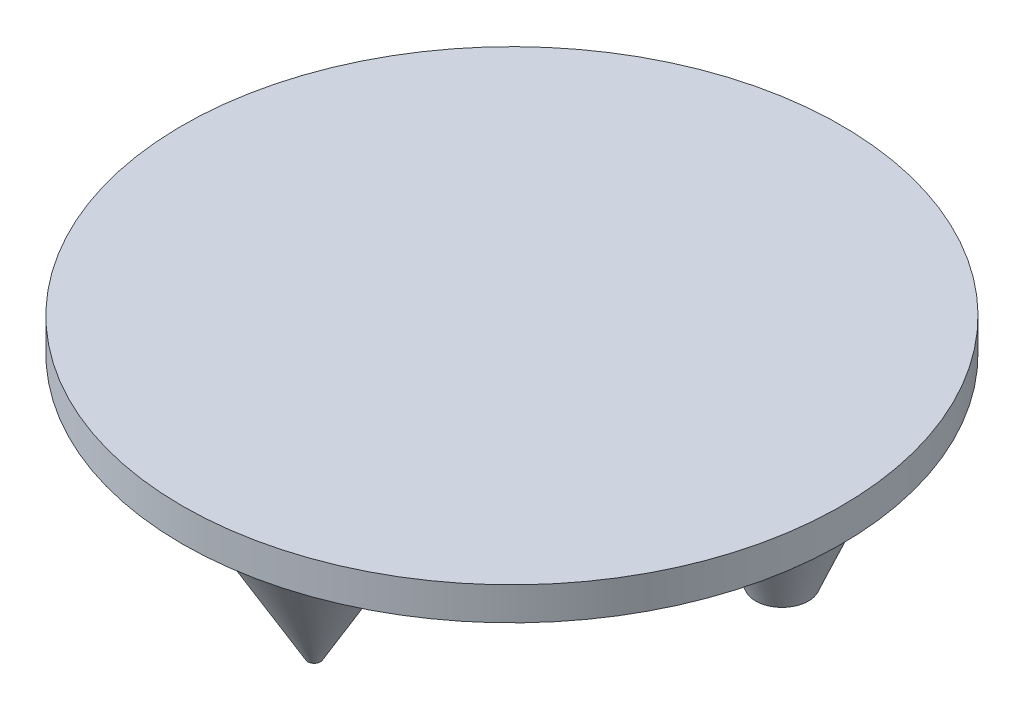
ISO-10303-21;
HEADER;
FILE_DESCRIPTION(('STEP AP214'),'2;1');
FILE_NAME('part.step','',(''),(''),'','','');
FILE_SCHEMA(('AUTOMOTIVE_DESIGN { 1 0 10303 214 1 1 1 1 }'));
ENDSEC;
DATA;
#1=APPLICATION_CONTEXT('core data for automotive mechanical design processes');
#2=APPLICATION_PROTOCOL_DEFINITION('international standard','automotive_design',2000,#1);
#3=PRODUCT_CONTEXT('',#1,'mechanical');
#4=PRODUCT('Part','Part','',(#3));
#5=PRODUCT_RELATED_PRODUCT_CATEGORY('part','',(#4));
#6=PRODUCT_DEFINITION_FORMATION('','',#4);
#7=PRODUCT_DEFINITION_CONTEXT('part definition',#1,'design');
#8=PRODUCT_DEFINITION('design','',#6,#7);
#9=PRODUCT_DEFINITION_SHAPE('','',#8);
#10=(LENGTH_UNIT() NAMED_UNIT(*) SI_UNIT(.MILLI.,.METRE.));
#11=(NAMED_UNIT(*) PLANE_ANGLE_UNIT() SI_UNIT($,.RADIAN.));
#12=(NAMED_UNIT(*) SI_UNIT($,.STERADIAN.) SOLID_ANGLE_UNIT());
#13=UNCERTAINTY_MEASURE_WITH_UNIT(LENGTH_MEASURE(1.E-05),#10,'distance_accuracy_value','');
#14=(GEOMETRIC_REPRESENTATION_CONTEXT(3) GLOBAL_UNCERTAINTY_ASSIGNED_CONTEXT((#13)) GLOBAL_UNIT_ASSIGNED_CONTEXT((#10,
#11,#12)) REPRESENTATION_CONTEXT('',''));
#15=CARTESIAN_POINT('',(0.,0.,0.));
#16=DIRECTION('',(0.,0.,1.));
#17=DIRECTION('',(1.,0.,0.));
#18=AXIS2_PLACEMENT_3D('',#15,#16,#17);
#19=CARTESIAN_POINT('',(0.,1.27,0.));
#20=DIRECTION('',(0.,-1.,0.));
#21=DIRECTION('',(0.,0.,-1.));
#22=AXIS2_PLACEMENT_3D('',#19,#20,#21);
#23=CYLINDRICAL_SURFACE('',#22,12.7);
#24=CARTESIAN_POINT('',(0.,1.27,0.));
#25=DIRECTION('',(0.,1.,0.));
#26=DIRECTION('',(0.,0.,1.));
#27=AXIS2_PLACEMENT_3D('',#24,#25,#26);
#28=CIRCLE('',#27,12.7);
#29=CARTESIAN_POINT('',(0.,1.27,12.7));
#30=VERTEX_POINT('',#29);
#31=EDGE_CURVE('E85',#30,#30,#28,.T.);
#32=ORIENTED_EDGE('',*,*,#31,.F.);
#33=EDGE_LOOP('',(#32));
#34=FACE_BOUND('',#33,.T.);
#35=CARTESIAN_POINT('',(0.,0.,0.));
#36=DIRECTION('',(0.,1.,0.));
#37=DIRECTION('',(0.,0.,1.));
#38=AXIS2_PLACEMENT_3D('',#35,#36,#37);
#39=CIRCLE('',#38,12.7);
#40=CARTESIAN_POINT('',(0.,0.,12.7));
#41=VERTEX_POINT('',#40);
#42=EDGE_CURVE('E78',#41,#41,#39,.T.);
#43=ORIENTED_EDGE('',*,*,#42,.T.);
#44=EDGE_LOOP('',(#43));
#45=FACE_BOUND('',#44,.T.);
#46=ADVANCED_FACE('F36',(#34,#45),#23,.T.);
#47=CARTESIAN_POINT('',(0.,1.27,0.));
#48=DIRECTION('',(0.,1.,0.));
#49=DIRECTION('',(0.,0.,1.));
#50=AXIS2_PLACEMENT_3D('',#47,#48,#49);
#51=PLANE('',#50);
#52=ORIENTED_EDGE('',*,*,#31,.T.);
#53=EDGE_LOOP('',(#52));
#54=FACE_BOUND('',#53,.T.);
#55=ADVANCED_FACE('F94',(#54),#51,.T.);
#56=CARTESIAN_POINT('',(0.,0.,0.));
#57=DIRECTION('',(0.,1.,0.));
#58=DIRECTION('',(0.,0.,1.));
#59=AXIS2_PLACEMENT_3D('',#56,#57,#58);
#60=PLANE('',#59);
#61=CARTESIAN_POINT('',(-6.59911357683741,0.,-3.81000000000003));
#62=DIRECTION('',(0.,1.,0.));
#63=DIRECTION('',(0.,0.,1.));
#64=AXIS2_PLACEMENT_3D('',#61,#62,#63);
#65=CIRCLE('',#64,3.175);
#66=CARTESIAN_POINT('',(-6.59911357683741,0.,-0.63500000000003));
#67=VERTEX_POINT('',#66);
#68=EDGE_CURVE('E73',#67,#67,#65,.F.);
#69=ORIENTED_EDGE('',*,*,#68,.F.);
#70=EDGE_LOOP('',(#69));
#71=FACE_BOUND('',#70,.T.);
#72=CARTESIAN_POINT('',(6.59911357683746,0.,-3.80999999999994));
#73=DIRECTION('',(0.,1.,0.));
#74=DIRECTION('',(0.,0.,1.));
#75=AXIS2_PLACEMENT_3D('',#72,#73,#74);
#76=CIRCLE('',#75,3.175);
#77=CARTESIAN_POINT('',(6.59911357683746,0.,-0.634999999999937));
#78=VERTEX_POINT('',#77);
#79=EDGE_CURVE('E77',#78,#78,#76,.F.);
#80=ORIENTED_EDGE('',*,*,#79,.F.);
#81=EDGE_LOOP('',(#80));
#82=FACE_BOUND('',#81,.T.);
#83=CARTESIAN_POINT('',(0.,0.,7.62));
#84=DIRECTION('',(0.,-1.,0.));
#85=DIRECTION('',(0.,0.,-1.));
#86=AXIS2_PLACEMENT_3D('',#83,#84,#85);
#87=CIRCLE('',#86,3.175);
#88=CARTESIAN_POINT('',(0.,0.,4.445));
#89=VERTEX_POINT('',#88);
#90=EDGE_CURVE('E79',#89,#89,#87,.T.);
#91=ORIENTED_EDGE('',*,*,#90,.F.);
#92=EDGE_LOOP('',(#91));
#93=FACE_BOUND('',#92,.T.);
#94=ORIENTED_EDGE('',*,*,#42,.F.);
#95=EDGE_LOOP('',(#94));
#96=FACE_BOUND('',#95,.T.);
#97=ADVANCED_FACE('F92',(#71,#82,#93,#96),#60,.F.);
#98=CARTESIAN_POINT('',(0.,-6.35,7.62));
#99=DIRECTION('',(0.,1.,0.));
#100=DIRECTION('',(0.,0.,1.));
#101=AXIS2_PLACEMENT_3D('',#98,#99,#100);
#102=CYLINDRICAL_SURFACE('',#101,3.175);
#103=CARTESIAN_POINT('',(0.,-0.589409051224924,7.62));
#104=DIRECTION('',(0.,-1.,0.));
#105=DIRECTION('',(0.,0.,-1.));
#106=AXIS2_PLACEMENT_3D('',#103,#104,#105);
#107=CIRCLE('',#106,3.175);
#108=CARTESIAN_POINT('',(0.,-0.589409051224924,4.445));
#109=VERTEX_POINT('',#108);
#110=EDGE_CURVE('E52',#109,#109,#107,.F.);
#111=ORIENTED_EDGE('',*,*,#110,.T.);
#112=EDGE_LOOP('',(#111));
#113=FACE_BOUND('',#112,.T.);
#114=ORIENTED_EDGE('',*,*,#90,.T.);
#115=EDGE_LOOP('',(#114));
#116=FACE_BOUND('',#115,.T.);
#117=ADVANCED_FACE('F87',(#113,#116),#102,.T.);
#118=CARTESIAN_POINT('',(0.,-6.35,7.62));
#119=DIRECTION('',(0.,-1.,0.));
#120=DIRECTION('',(0.,0.,-1.));
#121=AXIS2_PLACEMENT_3D('',#118,#119,#120);
#122=PLANE('',#121);
#123=CARTESIAN_POINT('',(0.,-6.35,7.62));
#124=DIRECTION('',(0.,-1.,0.));
#125=DIRECTION('',(0.,0.,-1.));
#126=AXIS2_PLACEMENT_3D('',#123,#124,#125);
#127=CIRCLE('',#126,0.242060632516702);
#128=CARTESIAN_POINT('',(0.,-6.35,7.8620606325167));
#129=VERTEX_POINT('',#128);
#130=EDGE_CURVE('E66',#129,#129,#127,.T.);
#131=ORIENTED_EDGE('',*,*,#130,.T.);
#132=EDGE_LOOP('',(#131));
#133=FACE_BOUND('',#132,.T.);
#134=ADVANCED_FACE('F143',(#133),#122,.T.);
#135=CARTESIAN_POINT('',(6.59911357683746,-6.35,-3.80999999999994));
#136=DIRECTION('',(0.,1.,0.));
#137=DIRECTION('',(0.866025403784443,0.,-0.499999999999992));
#138=AXIS2_PLACEMENT_3D('',#135,#136,#137);
#139=CYLINDRICAL_SURFACE('',#138,3.175);
#140=CARTESIAN_POINT('',(6.59911357683746,-0.753231159463757,-3.80999999999994));
#141=DIRECTION('',(0.,-1.,0.));
#142=DIRECTION('',(0.,0.,-1.));
#143=AXIS2_PLACEMENT_3D('',#140,#141,#142);
#144=CIRCLE('',#143,3.175);
#145=CARTESIAN_POINT('',(6.59911357683746,-0.753231159463757,-6.98499999999994));
#146=VERTEX_POINT('',#145);
#147=EDGE_CURVE('E64',#146,#146,#144,.F.);
#148=ORIENTED_EDGE('',*,*,#147,.T.);
#149=EDGE_LOOP('',(#148));
#150=FACE_BOUND('',#149,.T.);
#151=ORIENTED_EDGE('',*,*,#79,.T.);
#152=EDGE_LOOP('',(#151));
#153=FACE_BOUND('',#152,.T.);
#154=ADVANCED_FACE('F155',(#150,#153),#139,.T.);
#155=CARTESIAN_POINT('',(6.59911357683746,-6.35,-3.80999999999994));
#156=DIRECTION('',(0.,-1.,0.));
#157=DIRECTION('',(-0.866025403784443,0.,0.499999999999992));
#158=AXIS2_PLACEMENT_3D('',#155,#156,#157);
#159=PLANE('',#158);
#160=CARTESIAN_POINT('',(6.59911357683746,-6.35,-3.80999999999994));
#161=DIRECTION('',(0.,-1.,0.));
#162=DIRECTION('',(0.,0.,-1.));
#163=AXIS2_PLACEMENT_3D('',#160,#161,#162);
#164=CIRCLE('',#163,1.0186679336552);
#165=CARTESIAN_POINT('',(6.59911357683746,-6.35,-4.82866793365514));
#166=VERTEX_POINT('',#165);
#167=EDGE_CURVE('E70',#166,#166,#164,.T.);
#168=ORIENTED_EDGE('',*,*,#167,.T.);
#169=EDGE_LOOP('',(#168));
#170=FACE_BOUND('',#169,.T.);
#171=ADVANCED_FACE('F160',(#170),#159,.T.);
#172=CARTESIAN_POINT('',(-6.59911357683741,-6.35,-3.81000000000003));
#173=DIRECTION('',(0.,1.,0.));
#174=DIRECTION('',(-0.866025403784436,0.,-0.500000000000004));
#175=AXIS2_PLACEMENT_3D('',#172,#173,#174);
#176=CYLINDRICAL_SURFACE('',#175,3.175);
#177=CARTESIAN_POINT('',(-6.59911357683741,-0.913026279855822,-3.81000000000003));
#178=DIRECTION('',(0.,-1.,0.));
#179=DIRECTION('',(0.,0.,-1.));
#180=AXIS2_PLACEMENT_3D('',#177,#178,#179);
#181=CIRCLE('',#180,3.175);
#182=CARTESIAN_POINT('',(-6.59911357683741,-0.913026279855822,-6.98500000000003));
#183=VERTEX_POINT('',#182);
#184=EDGE_CURVE('E44',#183,#183,#181,.F.);
#185=ORIENTED_EDGE('',*,*,#184,.T.);
#186=EDGE_LOOP('',(#185));
#187=FACE_BOUND('',#186,.T.);
#188=ORIENTED_EDGE('',*,*,#68,.T.);
#189=EDGE_LOOP('',(#188));
#190=FACE_BOUND('',#189,.T.);
#191=ADVANCED_FACE('F163',(#187,#190),#176,.T.);
#192=CARTESIAN_POINT('',(-6.59911357683741,-6.35,-3.81000000000003));
#193=DIRECTION('',(0.,-1.,0.));
#194=DIRECTION('',(0.866025403784436,0.,0.500000000000004));
#195=AXIS2_PLACEMENT_3D('',#192,#193,#194);
#196=PLANE('',#195);
#197=CARTESIAN_POINT('',(-6.59911357683741,-6.35,-3.81000000000003));
#198=DIRECTION('',(0.,-1.,0.));
#199=DIRECTION('',(0.,0.,-1.));
#200=AXIS2_PLACEMENT_3D('',#197,#198,#199);
#201=CIRCLE('',#200,1.71833344034524);
#202=CARTESIAN_POINT('',(-6.59911357683741,-6.35,-5.52833344034527));
#203=VERTEX_POINT('',#202);
#204=EDGE_CURVE('E63',#203,#203,#201,.T.);
#205=ORIENTED_EDGE('',*,*,#204,.T.);
#206=EDGE_LOOP('',(#205));
#207=FACE_BOUND('',#206,.T.);
#208=ADVANCED_FACE('F120',(#207),#196,.T.);
#209=CARTESIAN_POINT('',(0.,-6.35,7.62));
#210=DIRECTION('',(0.,1.,0.));
#211=DIRECTION('',(0.,0.,1.));
#212=AXIS2_PLACEMENT_3D('',#209,#210,#211);
#213=CONICAL_SURFACE('',#212,0.242060632516702,0.523598775598297);
#214=CARTESIAN_POINT('',(0.,-1.85940905122492,7.62));
#215=DIRECTION('',(0.,1.,0.));
#216=DIRECTION('',(0.,0.,1.));
#217=AXIS2_PLACEMENT_3D('',#214,#215,#216);
#218=CIRCLE('',#217,2.83470452561248);
#219=CARTESIAN_POINT('',(0.,-1.85940905122492,10.4547045256125));
#220=VERTEX_POINT('',#219);
#221=EDGE_CURVE('E47',#220,#220,#218,.F.);
#222=CARTESIAN_POINT('',(0.,-1.85940905122492,10.4547045256125));
#223=CARTESIAN_POINT('',(0.,-1.90618604027466,10.4276978183927));
#224=CARTESIAN_POINT('',(0.,-1.9529630293244,10.400691111173));
#225=CARTESIAN_POINT('',(0.,-2.04651700742388,10.3466776967335));
#226=CARTESIAN_POINT('',(0.,-2.09329399647362,10.3196709895137));
#227=CARTESIAN_POINT('',(0.,-2.1868479745731,10.2656575750742));
#228=CARTESIAN_POINT('',(0.,-2.23362496362284,10.2386508678545));
#229=CARTESIAN_POINT('',(0.,-2.32717894172232,10.184637453415));
#230=CARTESIAN_POINT('',(0.,-2.37395593077206,10.1576307461953));
#231=CARTESIAN_POINT('',(0.,-2.46750990887155,10.1036173317558));
#232=CARTESIAN_POINT('',(0.,-2.51428689792129,10.076610624536));
#233=CARTESIAN_POINT('',(0.,-2.60784087602077,10.0225972100965));
#234=CARTESIAN_POINT('',(0.,-2.65461786507051,9.99559050287677));
#235=CARTESIAN_POINT('',(0.,-2.74817184316999,9.94157708843727));
#236=CARTESIAN_POINT('',(0.,-2.79494883221973,9.91457038121752));
#237=CARTESIAN_POINT('',(0.,-2.88850281031921,9.86055696677803));
#238=CARTESIAN_POINT('',(0.,-2.93527979936895,9.83355025955828));
#239=CARTESIAN_POINT('',(0.,-3.02883377746843,9.77953684511879));
#240=CARTESIAN_POINT('',(0.,-3.07561076651817,9.75253013789904));
#241=CARTESIAN_POINT('',(0.,-3.16916474461765,9.69851672345954));
#242=CARTESIAN_POINT('',(0.,-3.21594173366739,9.67151001623979));
#243=CARTESIAN_POINT('',(0.,-3.30949571176687,9.6174966018003));
#244=CARTESIAN_POINT('',(0.,-3.35627270081661,9.59048989458055));
#245=CARTESIAN_POINT('',(0.,-3.44982667891609,9.53647648014106));
#246=CARTESIAN_POINT('',(0.,-3.49660366796583,9.50946977292131));
#247=CARTESIAN_POINT('',(0.,-3.59015764606531,9.45545635848181));
#248=CARTESIAN_POINT('',(0.,-3.63693463511506,9.42844965126207));
#249=CARTESIAN_POINT('',(0.,-3.73048861321454,9.37443623682257));
#250=CARTESIAN_POINT('',(0.,-3.77726560226428,9.34742952960282));
#251=CARTESIAN_POINT('',(0.,-3.87081958036376,9.29341611516333));
#252=CARTESIAN_POINT('',(0.,-3.9175965694135,9.26640940794358));
#253=CARTESIAN_POINT('',(0.,-4.01115054751298,9.21239599350409));
#254=CARTESIAN_POINT('',(0.,-4.05792753656272,9.18538928628434));
#255=CARTESIAN_POINT('',(0.,-4.1514815146622,9.13137587184484));
#256=CARTESIAN_POINT('',(0.,-4.19825850371194,9.10436916462509));
#257=CARTESIAN_POINT('',(0.,-4.29181248181142,9.0503557501856));
#258=CARTESIAN_POINT('',(0.,-4.33858947086116,9.02334904296585));
#259=CARTESIAN_POINT('',(0.,-4.43214344896064,8.96933562852636));
#260=CARTESIAN_POINT('',(0.,-4.47892043801038,8.94232892130661));
#261=CARTESIAN_POINT('',(0.,-4.57247441610986,8.88831550686711));
#262=CARTESIAN_POINT('',(0.,-4.6192514051596,8.86130879964737));
#263=CARTESIAN_POINT('',(0.,-4.71280538325908,8.80729538520787));
#264=CARTESIAN_POINT('',(0.,-4.75958237230883,8.78028867798812));
#265=CARTESIAN_POINT('',(0.,-4.85313635040831,8.72627526354863));
#266=CARTESIAN_POINT('',(0.,-4.89991333945805,8.69926855632888));
#267=CARTESIAN_POINT('',(0.,-4.99346731755753,8.64525514188938));
#268=CARTESIAN_POINT('',(0.,-5.04024430660727,8.61824843466963));
#269=CARTESIAN_POINT('',(0.,-5.13379828470675,8.56423502023014));
#270=CARTESIAN_POINT('',(0.,-5.18057527375649,8.53722831301039));
#271=CARTESIAN_POINT('',(0.,-5.27412925185597,8.4832148985709));
#272=CARTESIAN_POINT('',(0.,-5.32090624090571,8.45620819135115));
#273=CARTESIAN_POINT('',(0.,-5.41446021900519,8.40219477691165));
#274=CARTESIAN_POINT('',(0.,-5.46123720805493,8.37518806969191));
#275=CARTESIAN_POINT('',(0.,-5.55479118615441,8.32117465525241));
#276=CARTESIAN_POINT('',(0.,-5.60156817520415,8.29416794803266));
#277=CARTESIAN_POINT('',(0.,-5.69512215330363,8.24015453359317));
#278=CARTESIAN_POINT('',(0.,-5.74189914235337,8.21314782637342));
#279=CARTESIAN_POINT('',(0.,-5.83545312045285,8.15913441193393));
#280=CARTESIAN_POINT('',(0.,-5.8822301095026,8.13212770471418));
#281=CARTESIAN_POINT('',(0.,-5.97578408760208,8.07811429027468));
#282=CARTESIAN_POINT('',(0.,-6.02256107665182,8.05110758305493));
#283=CARTESIAN_POINT('',(0.,-6.1161150547513,7.99709416861544));
#284=CARTESIAN_POINT('',(0.,-6.16289204380104,7.97008746139569));
#285=CARTESIAN_POINT('',(0.,-6.25644602190052,7.9160740469562));
#286=CARTESIAN_POINT('',(0.,-6.30322301095026,7.88906733973645));
#287=CARTESIAN_POINT('',(0.,-6.35,7.8620606325167));
#288=B_SPLINE_CURVE_WITH_KNOTS('',3,(#222,#223,#224,#225,#226,#227,#228,#229,#230,#231,#232,
#233,#234,#235,#236,#237,#238,#239,#240,#241,#242,#243,#244,#245,#246,#247,#248,#249,#250,#251,
#252,#253,#254,#255,#256,#257,#258,#259,#260,#261,#262,#263,#264,#265,#266,#267,#268,#269,#270,
#271,#272,#273,#274,#275,#276,#277,#278,#279,#280,#281,#282,#283,#284,#285,#286,#287),
.UNSPECIFIED.,.F.,.F.,(4,2,2,2,2,2,2,2,2,2,2,2,2,2,2,2,2,2,2,2,2,2,2,2,2,2,2,2,2,2,2,2,4),(0.,
0.162040243318486,0.324080486636973,0.486120729955459,0.648160973273946,0.810201216592433,
0.97224145991092,1.13428170322941,1.29632194654789,1.45836218986638,1.62040243318487,
1.78244267650335,1.94448291982184,2.10652316314033,2.26856340645881,2.4306036497773,
2.59264389309579,2.75468413641427,2.91672437973276,3.07876462305125,3.24080486636973,
3.40284510968822,3.56488535300671,3.72692559632519,3.88896583964368,4.05100608296217,
4.21304632628065,4.37508656959914,4.53712681291763,4.69916705623611,4.8612072995546,
5.02324754287309,5.18528778619157),.UNSPECIFIED.);
#289=EDGE_CURVE('BSEAM109',#220,#129,#288,.T.);
#290=ORIENTED_EDGE('',*,*,#221,.T.);
#291=ORIENTED_EDGE('',*,*,#130,.F.);
#292=ORIENTED_EDGE('',*,*,#289,.T.);
#293=ORIENTED_EDGE('',*,*,#289,.F.);
#294=EDGE_LOOP('',(#290,#292,#291,#293));
#295=FACE_BOUND('',#294,.T.);
#296=ADVANCED_FACE('F109',(#295),#213,.T.);
#297=CARTESIAN_POINT('',(6.59911357683746,-6.35,-3.80999999999994));
#298=DIRECTION('',(0.,1.,0.));
#299=DIRECTION('',(0.,0.,1.));
#300=AXIS2_PLACEMENT_3D('',#297,#298,#299);
#301=CONICAL_SURFACE('',#300,1.0186679336552,0.401425727958694);
#302=CARTESIAN_POINT('',(6.59911357683746,-1.74568822582651,-3.80999999999994));
#303=DIRECTION('',(0.,1.,0.));
#304=DIRECTION('',(0.,0.,1.));
#305=AXIS2_PLACEMENT_3D('',#302,#303,#304);
#306=CIRCLE('',#305,2.9730823277692);
#307=CARTESIAN_POINT('',(6.59911357683746,-1.74568822582651,-0.836917672230736));
#308=VERTEX_POINT('',#307);
#309=EDGE_CURVE('E59',#308,#308,#306,.F.);
#310=ORIENTED_EDGE('',*,*,#309,.T.);
#311=EDGE_LOOP('',(#310));
#312=FACE_BOUND('',#311,.T.);
#313=ORIENTED_EDGE('',*,*,#167,.F.);
#314=EDGE_LOOP('',(#313));
#315=FACE_BOUND('',#314,.T.);
#316=ADVANCED_FACE('F116',(#312,#315),#301,.T.);
#317=CARTESIAN_POINT('',(-6.59911357683741,-6.35,-3.81000000000003));
#318=DIRECTION('',(0.,1.,0.));
#319=DIRECTION('',(0.,0.,1.));
#320=AXIS2_PLACEMENT_3D('',#317,#318,#319);
#321=CONICAL_SURFACE('',#320,1.71833344034524,0.27925268031909);
#322=CARTESIAN_POINT('',(-6.59911357683741,-1.61314516363099,-3.81000000000003));
#323=DIRECTION('',(0.,1.,0.));
#324=DIRECTION('',(0.,0.,1.));
#325=AXIS2_PLACEMENT_3D('',#322,#323,#324);
#326=CIRCLE('',#325,3.07660470768333);
#327=CARTESIAN_POINT('',(-6.59911357683741,-1.61314516363099,-0.733395292316699));
#328=VERTEX_POINT('',#327);
#329=EDGE_CURVE('E10',#328,#328,#326,.F.);
#330=ORIENTED_EDGE('',*,*,#329,.T.);
#331=EDGE_LOOP('',(#330));
#332=FACE_BOUND('',#331,.T.);
#333=ORIENTED_EDGE('',*,*,#204,.F.);
#334=EDGE_LOOP('',(#333));
#335=FACE_BOUND('',#334,.T.);
#336=ADVANCED_FACE('F121',(#332,#335),#321,.T.);
#337=CARTESIAN_POINT('',(6.59911357683746,-0.753231159463757,-3.80999999999994));
#338=DIRECTION('',(0.,-1.,0.));
#339=DIRECTION('',(0.,0.,-1.));
#340=AXIS2_PLACEMENT_3D('',#337,#338,#339);
#341=DEGENERATE_TOROIDAL_SURFACE('',#340,0.635000000000001,2.54,.T.);
#342=ORIENTED_EDGE('',*,*,#309,.F.);
#343=EDGE_LOOP('',(#342));
#344=FACE_BOUND('',#343,.T.);
#345=ORIENTED_EDGE('',*,*,#147,.F.);
#346=EDGE_LOOP('',(#345));
#347=FACE_BOUND('',#346,.T.);
#348=ADVANCED_FACE('F127',(#344,#347),#341,.T.);
#349=CARTESIAN_POINT('',(0.,-0.589409051224924,7.62));
#350=DIRECTION('',(0.,-1.,0.));
#351=DIRECTION('',(0.,0.,-1.));
#352=AXIS2_PLACEMENT_3D('',#349,#350,#351);
#353=DEGENERATE_TOROIDAL_SURFACE('',#352,0.635000000000001,2.54,.T.);
#354=ORIENTED_EDGE('',*,*,#221,.F.);
#355=EDGE_LOOP('',(#354));
#356=FACE_BOUND('',#355,.T.);
#357=ORIENTED_EDGE('',*,*,#110,.F.);
#358=EDGE_LOOP('',(#357));
#359=FACE_BOUND('',#358,.T.);
#360=ADVANCED_FACE('F135',(#356,#359),#353,.T.);
#361=CARTESIAN_POINT('',(-6.59911357683741,-0.913026279855822,-3.81000000000003));
#362=DIRECTION('',(0.,-1.,0.));
#363=DIRECTION('',(0.,0.,-1.));
#364=AXIS2_PLACEMENT_3D('',#361,#362,#363);
#365=DEGENERATE_TOROIDAL_SURFACE('',#364,0.635000000000002,2.54,.T.);
#366=ORIENTED_EDGE('',*,*,#329,.F.);
#367=EDGE_LOOP('',(#366));
#368=FACE_BOUND('',#367,.T.);
#369=ORIENTED_EDGE('',*,*,#184,.F.);
#370=EDGE_LOOP('',(#369));
#371=FACE_BOUND('',#370,.T.);
#372=ADVANCED_FACE('F37',(#368,#371),#365,.T.);
#373=CLOSED_SHELL('',(#46,#55,#97,#117,#134,#154,#171,#191,#208,#296,#316,#336,#348,#360,#372));
#374=MANIFOLD_SOLID_BREP('B2',#373);
#375=ADVANCED_BREP_SHAPE_REPRESENTATION('',(#18,#374),#14);
#376=SHAPE_DEFINITION_REPRESENTATION(#9,#375);
ENDSEC;
END-ISO-10303-21;
